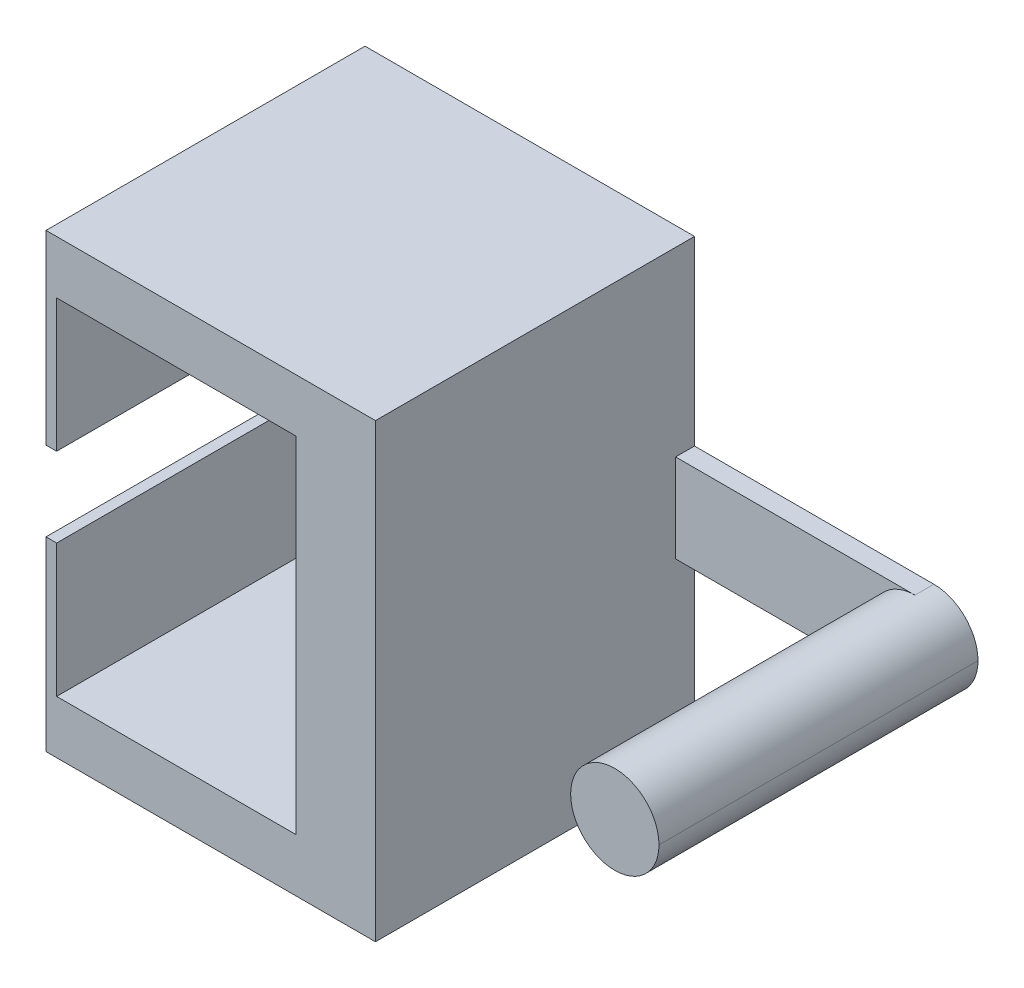
ISO-10303-21;
HEADER;
FILE_DESCRIPTION(('STEP AP214'),'2;1');
FILE_NAME('part.step','',(''),(''),'','','');
FILE_SCHEMA(('AUTOMOTIVE_DESIGN { 1 0 10303 214 1 1 1 1 }'));
ENDSEC;
DATA;
#1=APPLICATION_CONTEXT('core data for automotive mechanical design processes');
#2=APPLICATION_PROTOCOL_DEFINITION('international standard','automotive_design',2000,#1);
#3=PRODUCT_CONTEXT('',#1,'mechanical');
#4=PRODUCT('Part','Part','',(#3));
#5=PRODUCT_RELATED_PRODUCT_CATEGORY('part','',(#4));
#6=PRODUCT_DEFINITION_FORMATION('','',#4);
#7=PRODUCT_DEFINITION_CONTEXT('part definition',#1,'design');
#8=PRODUCT_DEFINITION('design','',#6,#7);
#9=PRODUCT_DEFINITION_SHAPE('','',#8);
#10=(LENGTH_UNIT() NAMED_UNIT(*) SI_UNIT(.MILLI.,.METRE.));
#11=(NAMED_UNIT(*) PLANE_ANGLE_UNIT() SI_UNIT($,.RADIAN.));
#12=(NAMED_UNIT(*) SI_UNIT($,.STERADIAN.) SOLID_ANGLE_UNIT());
#13=UNCERTAINTY_MEASURE_WITH_UNIT(LENGTH_MEASURE(1.E-05),#10,'distance_accuracy_value','');
#14=(GEOMETRIC_REPRESENTATION_CONTEXT(3) GLOBAL_UNCERTAINTY_ASSIGNED_CONTEXT((#13)) GLOBAL_UNIT_ASSIGNED_CONTEXT((#10,
#11,#12)) REPRESENTATION_CONTEXT('',''));
#15=CARTESIAN_POINT('',(0.,0.,0.));
#16=DIRECTION('',(0.,0.,1.));
#17=DIRECTION('',(1.,0.,0.));
#18=AXIS2_PLACEMENT_3D('',#15,#16,#17);
#19=CARTESIAN_POINT('',(0.,0.,0.));
#20=DIRECTION('',(0.,0.,1.));
#21=DIRECTION('',(1.,0.,0.));
#22=AXIS2_PLACEMENT_3D('',#19,#20,#21);
#23=PLANE('',#22);
#24=DIRECTION('',(1.,0.,0.));
#25=VECTOR('',#24,1.);
#26=CARTESIAN_POINT('',(-90.56878,35.93719,0.));
#27=LINE('',#26,#25);
#28=CARTESIAN_POINT('',(-90.56878,35.93719,0.));
#29=VERTEX_POINT('',#28);
#30=CARTESIAN_POINT('',(-38.11016,35.93719,0.));
#31=VERTEX_POINT('',#30);
#32=EDGE_CURVE('E9',#29,#31,#27,.T.);
#33=ORIENTED_EDGE('',*,*,#32,.T.);
#34=DIRECTION('',(0.,-1.,0.));
#35=VECTOR('',#34,1.);
#36=CARTESIAN_POINT('',(-38.11016,35.93719,0.));
#37=LINE('',#36,#35);
#38=CARTESIAN_POINT('',(-38.11016,7.03199,0.));
#39=VERTEX_POINT('',#38);
#40=EDGE_CURVE('E27',#31,#39,#37,.T.);
#41=ORIENTED_EDGE('',*,*,#40,.T.);
#42=DIRECTION('',(-1.,0.,0.));
#43=VECTOR('',#42,1.);
#44=CARTESIAN_POINT('',(0.,7.03199,0.));
#45=LINE('',#44,#43);
#46=CARTESIAN_POINT('',(0.,7.03199,0.));
#47=VERTEX_POINT('',#46);
#48=EDGE_CURVE('E309',#47,#39,#45,.T.);
#49=ORIENTED_EDGE('',*,*,#48,.F.);
#50=CARTESIAN_POINT('',(0.,0.,0.));
#51=DIRECTION('',(0.,0.,1.));
#52=DIRECTION('',(1.,0.,0.));
#53=AXIS2_PLACEMENT_3D('',#50,#51,#52);
#54=CIRCLE('',#53,7.03199);
#55=CARTESIAN_POINT('',(7.03199,0.,0.));
#56=VERTEX_POINT('',#55);
#57=EDGE_CURVE('E247',#56,#47,#54,.T.);
#58=ORIENTED_EDGE('',*,*,#57,.F.);
#59=CARTESIAN_POINT('',(0.,0.,0.));
#60=DIRECTION('',(0.,0.,1.));
#61=DIRECTION('',(0.,-1.,0.));
#62=AXIS2_PLACEMENT_3D('',#59,#60,#61);
#63=CIRCLE('',#62,7.03199);
#64=CARTESIAN_POINT('',(0.,-7.03199,0.));
#65=VERTEX_POINT('',#64);
#66=EDGE_CURVE('E253',#65,#56,#63,.T.);
#67=ORIENTED_EDGE('',*,*,#66,.F.);
#68=DIRECTION('',(1.,0.,0.));
#69=VECTOR('',#68,1.);
#70=CARTESIAN_POINT('',(-38.11016,-7.03199,0.));
#71=LINE('',#70,#69);
#72=CARTESIAN_POINT('',(-38.11016,-7.03199,0.));
#73=VERTEX_POINT('',#72);
#74=EDGE_CURVE('E213',#73,#65,#71,.T.);
#75=ORIENTED_EDGE('',*,*,#74,.F.);
#76=DIRECTION('',(0.,-1.,0.));
#77=VECTOR('',#76,1.);
#78=CARTESIAN_POINT('',(-38.11016,-7.03199,0.));
#79=LINE('',#78,#77);
#80=CARTESIAN_POINT('',(-38.11016,-35.93719,0.));
#81=VERTEX_POINT('',#80);
#82=EDGE_CURVE('E256',#73,#81,#79,.T.);
#83=ORIENTED_EDGE('',*,*,#82,.T.);
#84=DIRECTION('',(1.,0.,0.));
#85=VECTOR('',#84,1.);
#86=CARTESIAN_POINT('',(-90.56878,-35.93719,0.));
#87=LINE('',#86,#85);
#88=CARTESIAN_POINT('',(-90.56878,-35.93719,0.));
#89=VERTEX_POINT('',#88);
#90=EDGE_CURVE('E220',#89,#81,#87,.T.);
#91=ORIENTED_EDGE('',*,*,#90,.F.);
#92=DIRECTION('',(0.,-1.,0.));
#93=VECTOR('',#92,1.);
#94=CARTESIAN_POINT('',(-90.56878,-6.3246,0.));
#95=LINE('',#94,#93);
#96=CARTESIAN_POINT('',(-90.56878,-6.3246,0.));
#97=VERTEX_POINT('',#96);
#98=EDGE_CURVE('E226',#97,#89,#95,.T.);
#99=ORIENTED_EDGE('',*,*,#98,.F.);
#100=DIRECTION('',(1.,0.,0.));
#101=VECTOR('',#100,1.);
#102=CARTESIAN_POINT('',(-90.56878,-6.3246,0.));
#103=LINE('',#102,#101);
#104=CARTESIAN_POINT('',(-88.8746,-6.3246,0.));
#105=VERTEX_POINT('',#104);
#106=EDGE_CURVE('E233',#97,#105,#103,.T.);
#107=ORIENTED_EDGE('',*,*,#106,.T.);
#108=DIRECTION('',(0.,-1.,0.));
#109=VECTOR('',#108,1.);
#110=CARTESIAN_POINT('',(-88.8746,-6.3246,0.));
#111=LINE('',#110,#109);
#112=CARTESIAN_POINT('',(-88.8746,-27.47899,0.));
#113=VERTEX_POINT('',#112);
#114=EDGE_CURVE('E262',#105,#113,#111,.T.);
#115=ORIENTED_EDGE('',*,*,#114,.T.);
#116=DIRECTION('',(-1.,0.,0.));
#117=VECTOR('',#116,1.);
#118=CARTESIAN_POINT('',(-50.8,-27.47899,0.));
#119=LINE('',#118,#117);
#120=CARTESIAN_POINT('',(-50.8,-27.47899,0.));
#121=VERTEX_POINT('',#120);
#122=EDGE_CURVE('E160',#121,#113,#119,.T.);
#123=ORIENTED_EDGE('',*,*,#122,.F.);
#124=DIRECTION('',(0.,-1.,0.));
#125=VECTOR('',#124,1.);
#126=CARTESIAN_POINT('',(-50.8,27.47899,0.));
#127=LINE('',#126,#125);
#128=CARTESIAN_POINT('',(-50.8,27.47899,0.));
#129=VERTEX_POINT('',#128);
#130=EDGE_CURVE('E178',#129,#121,#127,.T.);
#131=ORIENTED_EDGE('',*,*,#130,.F.);
#132=DIRECTION('',(-1.,0.,0.));
#133=VECTOR('',#132,1.);
#134=CARTESIAN_POINT('',(-50.8,27.47899,0.));
#135=LINE('',#134,#133);
#136=CARTESIAN_POINT('',(-88.8746,27.47899,0.));
#137=VERTEX_POINT('',#136);
#138=EDGE_CURVE('E266',#129,#137,#135,.T.);
#139=ORIENTED_EDGE('',*,*,#138,.T.);
#140=DIRECTION('',(0.,-1.,0.));
#141=VECTOR('',#140,1.);
#142=CARTESIAN_POINT('',(-88.8746,27.47899,0.));
#143=LINE('',#142,#141);
#144=CARTESIAN_POINT('',(-88.8746,6.3246,0.));
#145=VERTEX_POINT('',#144);
#146=EDGE_CURVE('E275',#137,#145,#143,.T.);
#147=ORIENTED_EDGE('',*,*,#146,.T.);
#148=DIRECTION('',(1.,0.,0.));
#149=VECTOR('',#148,1.);
#150=CARTESIAN_POINT('',(-90.56878,6.3246,0.));
#151=LINE('',#150,#149);
#152=CARTESIAN_POINT('',(-90.56878,6.3246,0.));
#153=VERTEX_POINT('',#152);
#154=EDGE_CURVE('E197',#153,#145,#151,.T.);
#155=ORIENTED_EDGE('',*,*,#154,.F.);
#156=DIRECTION('',(0.,-1.,0.));
#157=VECTOR('',#156,1.);
#158=CARTESIAN_POINT('',(-90.56878,35.93719,0.));
#159=LINE('',#158,#157);
#160=EDGE_CURVE('E295',#29,#153,#159,.T.);
#161=ORIENTED_EDGE('',*,*,#160,.F.);
#162=EDGE_LOOP('',(#33,#41,#49,#58,#67,#75,#83,#91,#99,#107,#115,#123,#131,#139,#147,#155,#161));
#163=FACE_BOUND('',#162,.T.);
#164=ADVANCED_FACE('F15',(#163),#23,.F.);
#165=CARTESIAN_POINT('',(-50.8,35.93719,50.8));
#166=DIRECTION('',(0.,1.,0.));
#167=DIRECTION('',(0.,0.,-1.));
#168=AXIS2_PLACEMENT_3D('',#165,#166,#167);
#169=PLANE('',#168);
#170=DIRECTION('',(0.,0.,-1.));
#171=VECTOR('',#170,1.);
#172=CARTESIAN_POINT('',(-38.11016,35.93719,50.8));
#173=LINE('',#172,#171);
#174=CARTESIAN_POINT('',(-38.11016,35.93719,50.8));
#175=VERTEX_POINT('',#174);
#176=EDGE_CURVE('E277',#175,#31,#173,.T.);
#177=ORIENTED_EDGE('',*,*,#176,.T.);
#178=ORIENTED_EDGE('',*,*,#32,.F.);
#179=DIRECTION('',(0.,0.,-1.));
#180=VECTOR('',#179,1.);
#181=CARTESIAN_POINT('',(-90.56878,35.93719,50.8));
#182=LINE('',#181,#180);
#183=CARTESIAN_POINT('',(-90.56878,35.93719,50.8));
#184=VERTEX_POINT('',#183);
#185=EDGE_CURVE('E292',#184,#29,#182,.T.);
#186=ORIENTED_EDGE('',*,*,#185,.F.);
#187=DIRECTION('',(-1.,0.,0.));
#188=VECTOR('',#187,1.);
#189=CARTESIAN_POINT('',(-38.11016,35.93719,50.8));
#190=LINE('',#189,#188);
#191=EDGE_CURVE('E287',#175,#184,#190,.T.);
#192=ORIENTED_EDGE('',*,*,#191,.F.);
#193=EDGE_LOOP('',(#177,#178,#186,#192));
#194=FACE_BOUND('',#193,.T.);
#195=ADVANCED_FACE('F404',(#194),#169,.T.);
#196=CARTESIAN_POINT('',(-38.11016,0.,3.0099));
#197=DIRECTION('',(-1.,0.,0.));
#198=DIRECTION('',(0.,1.,0.));
#199=AXIS2_PLACEMENT_3D('',#196,#197,#198);
#200=PLANE('',#199);
#201=DIRECTION('',(0.,0.,1.));
#202=VECTOR('',#201,1.);
#203=CARTESIAN_POINT('',(-38.11016,7.03199,0.));
#204=LINE('',#203,#202);
#205=CARTESIAN_POINT('',(-38.11016,7.03199,3.0099));
#206=VERTEX_POINT('',#205);
#207=EDGE_CURVE('E307',#39,#206,#204,.T.);
#208=ORIENTED_EDGE('',*,*,#207,.F.);
#209=ORIENTED_EDGE('',*,*,#40,.F.);
#210=ORIENTED_EDGE('',*,*,#176,.F.);
#211=DIRECTION('',(0.,1.,0.));
#212=VECTOR('',#211,1.);
#213=CARTESIAN_POINT('',(-38.11016,-35.93719,50.8));
#214=LINE('',#213,#212);
#215=CARTESIAN_POINT('',(-38.11016,-35.93719,50.8));
#216=VERTEX_POINT('',#215);
#217=EDGE_CURVE('E147',#216,#175,#214,.T.);
#218=ORIENTED_EDGE('',*,*,#217,.F.);
#219=DIRECTION('',(0.,0.,1.));
#220=VECTOR('',#219,1.);
#221=CARTESIAN_POINT('',(-38.11016,-35.93719,0.));
#222=LINE('',#221,#220);
#223=EDGE_CURVE('E224',#81,#216,#222,.T.);
#224=ORIENTED_EDGE('',*,*,#223,.F.);
#225=ORIENTED_EDGE('',*,*,#82,.F.);
#226=DIRECTION('',(0.,0.,1.));
#227=VECTOR('',#226,1.);
#228=CARTESIAN_POINT('',(-38.11016,-7.03199,0.));
#229=LINE('',#228,#227);
#230=CARTESIAN_POINT('',(-38.11016,-7.03199,3.0099));
#231=VERTEX_POINT('',#230);
#232=EDGE_CURVE('E297',#73,#231,#229,.T.);
#233=ORIENTED_EDGE('',*,*,#232,.T.);
#234=DIRECTION('',(0.,1.,0.));
#235=VECTOR('',#234,1.);
#236=CARTESIAN_POINT('',(-38.11016,-7.03199,3.0099));
#237=LINE('',#236,#235);
#238=EDGE_CURVE('E321',#231,#206,#237,.T.);
#239=ORIENTED_EDGE('',*,*,#238,.T.);
#240=EDGE_LOOP('',(#208,#209,#210,#218,#224,#225,#233,#239));
#241=FACE_BOUND('',#240,.T.);
#242=ADVANCED_FACE('F403',(#241),#200,.F.);
#243=CARTESIAN_POINT('',(0.,7.03199,0.));
#244=DIRECTION('',(0.,1.,0.));
#245=DIRECTION('',(-1.,0.,0.));
#246=AXIS2_PLACEMENT_3D('',#243,#244,#245);
#247=PLANE('',#246);
#248=DIRECTION('',(-1.,0.,0.));
#249=VECTOR('',#248,1.);
#250=CARTESIAN_POINT('',(0.,7.03199,3.0099));
#251=LINE('',#250,#249);
#252=CARTESIAN_POINT('',(0.,7.03199,3.0099));
#253=VERTEX_POINT('',#252);
#254=EDGE_CURVE('E206',#253,#206,#251,.T.);
#255=ORIENTED_EDGE('',*,*,#254,.F.);
#256=DIRECTION('',(0.,0.,1.));
#257=VECTOR('',#256,1.);
#258=CARTESIAN_POINT('',(0.,7.03199,0.));
#259=LINE('',#258,#257);
#260=EDGE_CURVE('E334',#47,#253,#259,.T.);
#261=ORIENTED_EDGE('',*,*,#260,.F.);
#262=ORIENTED_EDGE('',*,*,#48,.T.);
#263=ORIENTED_EDGE('',*,*,#207,.T.);
#264=EDGE_LOOP('',(#255,#261,#262,#263));
#265=FACE_BOUND('',#264,.T.);
#266=ADVANCED_FACE('F410',(#265),#247,.T.);
#267=CARTESIAN_POINT('',(0.,0.,0.));
#268=DIRECTION('',(0.,0.,-1.));
#269=DIRECTION('',(1.,0.,0.));
#270=AXIS2_PLACEMENT_3D('',#267,#268,#269);
#271=CYLINDRICAL_SURFACE('',#270,7.03199);
#272=DIRECTION('',(0.,0.,1.));
#273=VECTOR('',#272,1.);
#274=CARTESIAN_POINT('',(-7.03199,0.,3.0099));
#275=LINE('',#274,#273);
#276=CARTESIAN_POINT('',(-7.03199,0.,3.0099));
#277=VERTEX_POINT('',#276);
#278=CARTESIAN_POINT('',(-7.03199,0.,50.8));
#279=VERTEX_POINT('',#278);
#280=EDGE_CURVE('E313',#277,#279,#275,.T.);
#281=ORIENTED_EDGE('',*,*,#280,.T.);
#282=CARTESIAN_POINT('',(0.,0.,50.8));
#283=DIRECTION('',(0.,0.,1.));
#284=DIRECTION('',(1.,0.,0.));
#285=AXIS2_PLACEMENT_3D('',#282,#283,#284);
#286=CIRCLE('',#285,7.03199);
#287=CARTESIAN_POINT('',(7.03199,0.,50.8));
#288=VERTEX_POINT('',#287);
#289=EDGE_CURVE('E210',#288,#279,#286,.T.);
#290=ORIENTED_EDGE('',*,*,#289,.F.);
#291=DIRECTION('',(0.,0.,1.));
#292=VECTOR('',#291,1.);
#293=CARTESIAN_POINT('',(7.03199,0.,0.));
#294=LINE('',#293,#292);
#295=EDGE_CURVE('E215',#56,#288,#294,.T.);
#296=ORIENTED_EDGE('',*,*,#295,.F.);
#297=ORIENTED_EDGE('',*,*,#57,.T.);
#298=ORIENTED_EDGE('',*,*,#260,.T.);
#299=CARTESIAN_POINT('',(0.,0.,3.0099));
#300=DIRECTION('',(0.,0.,1.));
#301=DIRECTION('',(0.,1.,0.));
#302=AXIS2_PLACEMENT_3D('',#299,#300,#301);
#303=CIRCLE('',#302,7.03199);
#304=EDGE_CURVE('E251',#253,#277,#303,.T.);
#305=ORIENTED_EDGE('',*,*,#304,.T.);
#306=EDGE_LOOP('',(#281,#290,#296,#297,#298,#305));
#307=FACE_BOUND('',#306,.T.);
#308=ADVANCED_FACE('F348',(#307),#271,.T.);
#309=CARTESIAN_POINT('',(0.,0.,0.));
#310=DIRECTION('',(0.,0.,-1.));
#311=DIRECTION('',(1.,0.,0.));
#312=AXIS2_PLACEMENT_3D('',#309,#310,#311);
#313=CYLINDRICAL_SURFACE('',#312,7.03199);
#314=DIRECTION('',(0.,0.,1.));
#315=VECTOR('',#314,1.);
#316=CARTESIAN_POINT('',(0.,-7.03199,0.));
#317=LINE('',#316,#315);
#318=CARTESIAN_POINT('',(0.,-7.03199,3.0099));
#319=VERTEX_POINT('',#318);
#320=EDGE_CURVE('E203',#65,#319,#317,.T.);
#321=ORIENTED_EDGE('',*,*,#320,.F.);
#322=ORIENTED_EDGE('',*,*,#66,.T.);
#323=ORIENTED_EDGE('',*,*,#295,.T.);
#324=CARTESIAN_POINT('',(0.,0.,50.8));
#325=DIRECTION('',(0.,0.,1.));
#326=DIRECTION('',(-1.,0.,0.));
#327=AXIS2_PLACEMENT_3D('',#324,#325,#326);
#328=CIRCLE('',#327,7.03199);
#329=EDGE_CURVE('E201',#279,#288,#328,.T.);
#330=ORIENTED_EDGE('',*,*,#329,.F.);
#331=ORIENTED_EDGE('',*,*,#280,.F.);
#332=CARTESIAN_POINT('',(0.,0.,3.0099));
#333=DIRECTION('',(0.,0.,1.));
#334=DIRECTION('',(-1.,0.,0.));
#335=AXIS2_PLACEMENT_3D('',#332,#333,#334);
#336=CIRCLE('',#335,7.03199);
#337=EDGE_CURVE('E208',#277,#319,#336,.T.);
#338=ORIENTED_EDGE('',*,*,#337,.T.);
#339=EDGE_LOOP('',(#321,#322,#323,#330,#331,#338));
#340=FACE_BOUND('',#339,.T.);
#341=ADVANCED_FACE('F354',(#340),#313,.T.);
#342=CARTESIAN_POINT('',(-50.8,-7.03199,0.));
#343=DIRECTION('',(0.,-1.,0.));
#344=DIRECTION('',(1.,0.,0.));
#345=AXIS2_PLACEMENT_3D('',#342,#343,#344);
#346=PLANE('',#345);
#347=ORIENTED_EDGE('',*,*,#74,.T.);
#348=ORIENTED_EDGE('',*,*,#320,.T.);
#349=DIRECTION('',(1.,0.,0.));
#350=VECTOR('',#349,1.);
#351=CARTESIAN_POINT('',(-38.11016,-7.03199,3.0099));
#352=LINE('',#351,#350);
#353=EDGE_CURVE('E315',#231,#319,#352,.T.);
#354=ORIENTED_EDGE('',*,*,#353,.F.);
#355=ORIENTED_EDGE('',*,*,#232,.F.);
#356=EDGE_LOOP('',(#347,#348,#354,#355));
#357=FACE_BOUND('',#356,.T.);
#358=ADVANCED_FACE('F357',(#357),#346,.T.);
#359=CARTESIAN_POINT('',(-50.8,-35.93719,0.));
#360=DIRECTION('',(0.,-1.,0.));
#361=DIRECTION('',(0.,0.,1.));
#362=AXIS2_PLACEMENT_3D('',#359,#360,#361);
#363=PLANE('',#362);
#364=ORIENTED_EDGE('',*,*,#223,.T.);
#365=DIRECTION('',(-1.,0.,0.));
#366=VECTOR('',#365,1.);
#367=CARTESIAN_POINT('',(-38.11016,-35.93719,50.8));
#368=LINE('',#367,#366);
#369=CARTESIAN_POINT('',(-90.56878,-35.93719,50.8));
#370=VERTEX_POINT('',#369);
#371=EDGE_CURVE('E218',#216,#370,#368,.T.);
#372=ORIENTED_EDGE('',*,*,#371,.T.);
#373=DIRECTION('',(0.,0.,1.));
#374=VECTOR('',#373,1.);
#375=CARTESIAN_POINT('',(-90.56878,-35.93719,0.));
#376=LINE('',#375,#374);
#377=EDGE_CURVE('E212',#89,#370,#376,.T.);
#378=ORIENTED_EDGE('',*,*,#377,.F.);
#379=ORIENTED_EDGE('',*,*,#90,.T.);
#380=EDGE_LOOP('',(#364,#372,#378,#379));
#381=FACE_BOUND('',#380,.T.);
#382=ADVANCED_FACE('F399',(#381),#363,.T.);
#383=CARTESIAN_POINT('',(-90.56878,0.,3.0099));
#384=DIRECTION('',(-1.,0.,0.));
#385=DIRECTION('',(0.,1.,0.));
#386=AXIS2_PLACEMENT_3D('',#383,#384,#385);
#387=PLANE('',#386);
#388=ORIENTED_EDGE('',*,*,#377,.T.);
#389=DIRECTION('',(0.,1.,0.));
#390=VECTOR('',#389,1.);
#391=CARTESIAN_POINT('',(-90.56878,-35.93719,50.8));
#392=LINE('',#391,#390);
#393=CARTESIAN_POINT('',(-90.56878,-6.3246,50.8));
#394=VERTEX_POINT('',#393);
#395=EDGE_CURVE('E217',#370,#394,#392,.T.);
#396=ORIENTED_EDGE('',*,*,#395,.T.);
#397=DIRECTION('',(0.,0.,-1.));
#398=VECTOR('',#397,1.);
#399=CARTESIAN_POINT('',(-90.56878,-6.3246,50.8));
#400=LINE('',#399,#398);
#401=EDGE_CURVE('E234',#394,#97,#400,.T.);
#402=ORIENTED_EDGE('',*,*,#401,.T.);
#403=ORIENTED_EDGE('',*,*,#98,.T.);
#404=EDGE_LOOP('',(#388,#396,#402,#403));
#405=FACE_BOUND('',#404,.T.);
#406=ADVANCED_FACE('F398',(#405),#387,.T.);
#407=CARTESIAN_POINT('',(-90.56878,-6.3246,50.8));
#408=DIRECTION('',(0.,1.,0.));
#409=DIRECTION('',(0.,0.,-1.));
#410=AXIS2_PLACEMENT_3D('',#407,#408,#409);
#411=PLANE('',#410);
#412=DIRECTION('',(1.,0.,0.));
#413=VECTOR('',#412,1.);
#414=CARTESIAN_POINT('',(-90.56878,-6.3246,50.8));
#415=LINE('',#414,#413);
#416=CARTESIAN_POINT('',(-88.8746,-6.3246,50.8));
#417=VERTEX_POINT('',#416);
#418=EDGE_CURVE('E221',#394,#417,#415,.T.);
#419=ORIENTED_EDGE('',*,*,#418,.T.);
#420=DIRECTION('',(0.,0.,-1.));
#421=VECTOR('',#420,1.);
#422=CARTESIAN_POINT('',(-88.8746,-6.3246,50.8));
#423=LINE('',#422,#421);
#424=EDGE_CURVE('E140',#417,#105,#423,.T.);
#425=ORIENTED_EDGE('',*,*,#424,.T.);
#426=ORIENTED_EDGE('',*,*,#106,.F.);
#427=ORIENTED_EDGE('',*,*,#401,.F.);
#428=EDGE_LOOP('',(#419,#425,#426,#427));
#429=FACE_BOUND('',#428,.T.);
#430=ADVANCED_FACE('F231',(#429),#411,.T.);
#431=CARTESIAN_POINT('',(-88.8746,0.,3.0099));
#432=DIRECTION('',(-1.,0.,0.));
#433=DIRECTION('',(0.,1.,0.));
#434=AXIS2_PLACEMENT_3D('',#431,#432,#433);
#435=PLANE('',#434);
#436=ORIENTED_EDGE('',*,*,#114,.F.);
#437=ORIENTED_EDGE('',*,*,#424,.F.);
#438=DIRECTION('',(0.,1.,0.));
#439=VECTOR('',#438,1.);
#440=CARTESIAN_POINT('',(-88.8746,-27.47899,50.8));
#441=LINE('',#440,#439);
#442=CARTESIAN_POINT('',(-88.8746,-27.47899,50.8));
#443=VERTEX_POINT('',#442);
#444=EDGE_CURVE('E143',#443,#417,#441,.T.);
#445=ORIENTED_EDGE('',*,*,#444,.F.);
#446=DIRECTION('',(0.,0.,-1.));
#447=VECTOR('',#446,1.);
#448=CARTESIAN_POINT('',(-88.8746,-27.47899,50.8));
#449=LINE('',#448,#447);
#450=EDGE_CURVE('E145',#443,#113,#449,.T.);
#451=ORIENTED_EDGE('',*,*,#450,.T.);
#452=EDGE_LOOP('',(#436,#437,#445,#451));
#453=FACE_BOUND('',#452,.T.);
#454=ADVANCED_FACE('F141',(#453),#435,.F.);
#455=CARTESIAN_POINT('',(-50.8,-27.47899,50.8));
#456=DIRECTION('',(0.,1.,0.));
#457=DIRECTION('',(0.,0.,-1.));
#458=AXIS2_PLACEMENT_3D('',#455,#456,#457);
#459=PLANE('',#458);
#460=DIRECTION('',(-1.,0.,0.));
#461=VECTOR('',#460,1.);
#462=CARTESIAN_POINT('',(-50.8,-27.47899,50.8));
#463=LINE('',#462,#461);
#464=CARTESIAN_POINT('',(-50.8,-27.47899,50.8));
#465=VERTEX_POINT('',#464);
#466=EDGE_CURVE('E149',#465,#443,#463,.T.);
#467=ORIENTED_EDGE('',*,*,#466,.F.);
#468=DIRECTION('',(0.,0.,1.));
#469=VECTOR('',#468,1.);
#470=CARTESIAN_POINT('',(-50.8,-27.47899,0.));
#471=LINE('',#470,#469);
#472=EDGE_CURVE('E176',#121,#465,#471,.T.);
#473=ORIENTED_EDGE('',*,*,#472,.F.);
#474=ORIENTED_EDGE('',*,*,#122,.T.);
#475=ORIENTED_EDGE('',*,*,#450,.F.);
#476=EDGE_LOOP('',(#467,#473,#474,#475));
#477=FACE_BOUND('',#476,.T.);
#478=ADVANCED_FACE('F153',(#477),#459,.T.);
#479=CARTESIAN_POINT('',(-50.8,7.03199,0.));
#480=DIRECTION('',(-1.,0.,0.));
#481=DIRECTION('',(0.,-1.,0.));
#482=AXIS2_PLACEMENT_3D('',#479,#480,#481);
#483=PLANE('',#482);
#484=DIRECTION('',(0.,1.,0.));
#485=VECTOR('',#484,1.);
#486=CARTESIAN_POINT('',(-50.8,-27.47899,50.8));
#487=LINE('',#486,#485);
#488=CARTESIAN_POINT('',(-50.8,27.47899,50.8));
#489=VERTEX_POINT('',#488);
#490=EDGE_CURVE('E164',#465,#489,#487,.T.);
#491=ORIENTED_EDGE('',*,*,#490,.T.);
#492=DIRECTION('',(0.,0.,1.));
#493=VECTOR('',#492,1.);
#494=CARTESIAN_POINT('',(-50.8,27.47899,0.));
#495=LINE('',#494,#493);
#496=EDGE_CURVE('E177',#129,#489,#495,.T.);
#497=ORIENTED_EDGE('',*,*,#496,.F.);
#498=ORIENTED_EDGE('',*,*,#130,.T.);
#499=ORIENTED_EDGE('',*,*,#472,.T.);
#500=EDGE_LOOP('',(#491,#497,#498,#499));
#501=FACE_BOUND('',#500,.T.);
#502=ADVANCED_FACE('F395',(#501),#483,.T.);
#503=CARTESIAN_POINT('',(-50.8,27.47899,0.));
#504=DIRECTION('',(0.,-1.,0.));
#505=DIRECTION('',(0.,0.,1.));
#506=AXIS2_PLACEMENT_3D('',#503,#504,#505);
#507=PLANE('',#506);
#508=ORIENTED_EDGE('',*,*,#138,.F.);
#509=ORIENTED_EDGE('',*,*,#496,.T.);
#510=DIRECTION('',(-1.,0.,0.));
#511=VECTOR('',#510,1.);
#512=CARTESIAN_POINT('',(-50.8,27.47899,50.8));
#513=LINE('',#512,#511);
#514=CARTESIAN_POINT('',(-88.8746,27.47899,50.8));
#515=VERTEX_POINT('',#514);
#516=EDGE_CURVE('E181',#489,#515,#513,.T.);
#517=ORIENTED_EDGE('',*,*,#516,.T.);
#518=DIRECTION('',(0.,0.,1.));
#519=VECTOR('',#518,1.);
#520=CARTESIAN_POINT('',(-88.8746,27.47899,0.));
#521=LINE('',#520,#519);
#522=EDGE_CURVE('E188',#137,#515,#521,.T.);
#523=ORIENTED_EDGE('',*,*,#522,.F.);
#524=EDGE_LOOP('',(#508,#509,#517,#523));
#525=FACE_BOUND('',#524,.T.);
#526=ADVANCED_FACE('F394',(#525),#507,.T.);
#527=CARTESIAN_POINT('',(-88.8746,0.,3.0099));
#528=DIRECTION('',(-1.,0.,0.));
#529=DIRECTION('',(0.,1.,0.));
#530=AXIS2_PLACEMENT_3D('',#527,#528,#529);
#531=PLANE('',#530);
#532=DIRECTION('',(0.,1.,0.));
#533=VECTOR('',#532,1.);
#534=CARTESIAN_POINT('',(-88.8746,6.3246,50.8));
#535=LINE('',#534,#533);
#536=CARTESIAN_POINT('',(-88.8746,6.3246,50.8));
#537=VERTEX_POINT('',#536);
#538=EDGE_CURVE('E289',#537,#515,#535,.T.);
#539=ORIENTED_EDGE('',*,*,#538,.F.);
#540=DIRECTION('',(0.,0.,1.));
#541=VECTOR('',#540,1.);
#542=CARTESIAN_POINT('',(-88.8746,6.3246,0.));
#543=LINE('',#542,#541);
#544=EDGE_CURVE('E281',#145,#537,#543,.T.);
#545=ORIENTED_EDGE('',*,*,#544,.F.);
#546=ORIENTED_EDGE('',*,*,#146,.F.);
#547=ORIENTED_EDGE('',*,*,#522,.T.);
#548=EDGE_LOOP('',(#539,#545,#546,#547));
#549=FACE_BOUND('',#548,.T.);
#550=ADVANCED_FACE('F392',(#549),#531,.F.);
#551=CARTESIAN_POINT('',(-90.56878,6.3246,0.));
#552=DIRECTION('',(0.,-1.,0.));
#553=DIRECTION('',(0.,0.,1.));
#554=AXIS2_PLACEMENT_3D('',#551,#552,#553);
#555=PLANE('',#554);
#556=ORIENTED_EDGE('',*,*,#154,.T.);
#557=ORIENTED_EDGE('',*,*,#544,.T.);
#558=DIRECTION('',(1.,0.,0.));
#559=VECTOR('',#558,1.);
#560=CARTESIAN_POINT('',(-90.56878,6.3246,50.8));
#561=LINE('',#560,#559);
#562=CARTESIAN_POINT('',(-90.56878,6.3246,50.8));
#563=VERTEX_POINT('',#562);
#564=EDGE_CURVE('E285',#563,#537,#561,.T.);
#565=ORIENTED_EDGE('',*,*,#564,.F.);
#566=DIRECTION('',(0.,0.,1.));
#567=VECTOR('',#566,1.);
#568=CARTESIAN_POINT('',(-90.56878,6.3246,0.));
#569=LINE('',#568,#567);
#570=EDGE_CURVE('E174',#153,#563,#569,.T.);
#571=ORIENTED_EDGE('',*,*,#570,.F.);
#572=EDGE_LOOP('',(#556,#557,#565,#571));
#573=FACE_BOUND('',#572,.T.);
#574=ADVANCED_FACE('F385',(#573),#555,.T.);
#575=CARTESIAN_POINT('',(-90.56878,0.,3.0099));
#576=DIRECTION('',(-1.,0.,0.));
#577=DIRECTION('',(0.,1.,0.));
#578=AXIS2_PLACEMENT_3D('',#575,#576,#577);
#579=PLANE('',#578);
#580=ORIENTED_EDGE('',*,*,#185,.T.);
#581=ORIENTED_EDGE('',*,*,#160,.T.);
#582=ORIENTED_EDGE('',*,*,#570,.T.);
#583=DIRECTION('',(0.,1.,0.));
#584=VECTOR('',#583,1.);
#585=CARTESIAN_POINT('',(-90.56878,6.3246,50.8));
#586=LINE('',#585,#584);
#587=EDGE_CURVE('E19',#563,#184,#586,.T.);
#588=ORIENTED_EDGE('',*,*,#587,.T.);
#589=EDGE_LOOP('',(#580,#581,#582,#588));
#590=FACE_BOUND('',#589,.T.);
#591=ADVANCED_FACE('F386',(#590),#579,.T.);
#592=CARTESIAN_POINT('',(-50.8,-35.93719,50.8));
#593=DIRECTION('',(0.,0.,1.));
#594=DIRECTION('',(0.,1.,0.));
#595=AXIS2_PLACEMENT_3D('',#592,#593,#594);
#596=PLANE('',#595);
#597=ORIENTED_EDGE('',*,*,#490,.F.);
#598=ORIENTED_EDGE('',*,*,#466,.T.);
#599=ORIENTED_EDGE('',*,*,#444,.T.);
#600=ORIENTED_EDGE('',*,*,#418,.F.);
#601=ORIENTED_EDGE('',*,*,#395,.F.);
#602=ORIENTED_EDGE('',*,*,#371,.F.);
#603=ORIENTED_EDGE('',*,*,#217,.T.);
#604=ORIENTED_EDGE('',*,*,#191,.T.);
#605=ORIENTED_EDGE('',*,*,#587,.F.);
#606=ORIENTED_EDGE('',*,*,#564,.T.);
#607=ORIENTED_EDGE('',*,*,#538,.T.);
#608=ORIENTED_EDGE('',*,*,#516,.F.);
#609=EDGE_LOOP('',(#597,#598,#599,#600,#601,#602,#603,#604,#605,#606,#607,#608));
#610=FACE_BOUND('',#609,.T.);
#611=ADVANCED_FACE('F165',(#610),#596,.T.);
#612=CARTESIAN_POINT('',(0.,0.,3.0099));
#613=DIRECTION('',(0.,0.,1.));
#614=DIRECTION('',(0.,1.,0.));
#615=AXIS2_PLACEMENT_3D('',#612,#613,#614);
#616=PLANE('',#615);
#617=ORIENTED_EDGE('',*,*,#353,.T.);
#618=ORIENTED_EDGE('',*,*,#337,.F.);
#619=ORIENTED_EDGE('',*,*,#304,.F.);
#620=ORIENTED_EDGE('',*,*,#254,.T.);
#621=ORIENTED_EDGE('',*,*,#238,.F.);
#622=EDGE_LOOP('',(#617,#618,#619,#620,#621));
#623=FACE_BOUND('',#622,.T.);
#624=ADVANCED_FACE('F17',(#623),#616,.T.);
#625=CARTESIAN_POINT('',(0.,0.,50.8));
#626=DIRECTION('',(0.,0.,1.));
#627=DIRECTION('',(1.,0.,0.));
#628=AXIS2_PLACEMENT_3D('',#625,#626,#627);
#629=PLANE('',#628);
#630=ORIENTED_EDGE('',*,*,#329,.T.);
#631=ORIENTED_EDGE('',*,*,#289,.T.);
#632=EDGE_LOOP('',(#630,#631));
#633=FACE_BOUND('',#632,.T.);
#634=ADVANCED_FACE('F426',(#633),#629,.T.);
#635=CLOSED_SHELL('',(#164,#195,#242,#266,#308,#341,#358,#382,#406,#430,#454,#478,#502,#526,
#550,#574,#591,#611,#624,#634));
#636=MANIFOLD_SOLID_BREP('B1',#635);
#637=ADVANCED_BREP_SHAPE_REPRESENTATION('',(#18,#636),#14);
#638=SHAPE_DEFINITION_REPRESENTATION(#9,#637);
ENDSEC;
END-ISO-10303-21;
